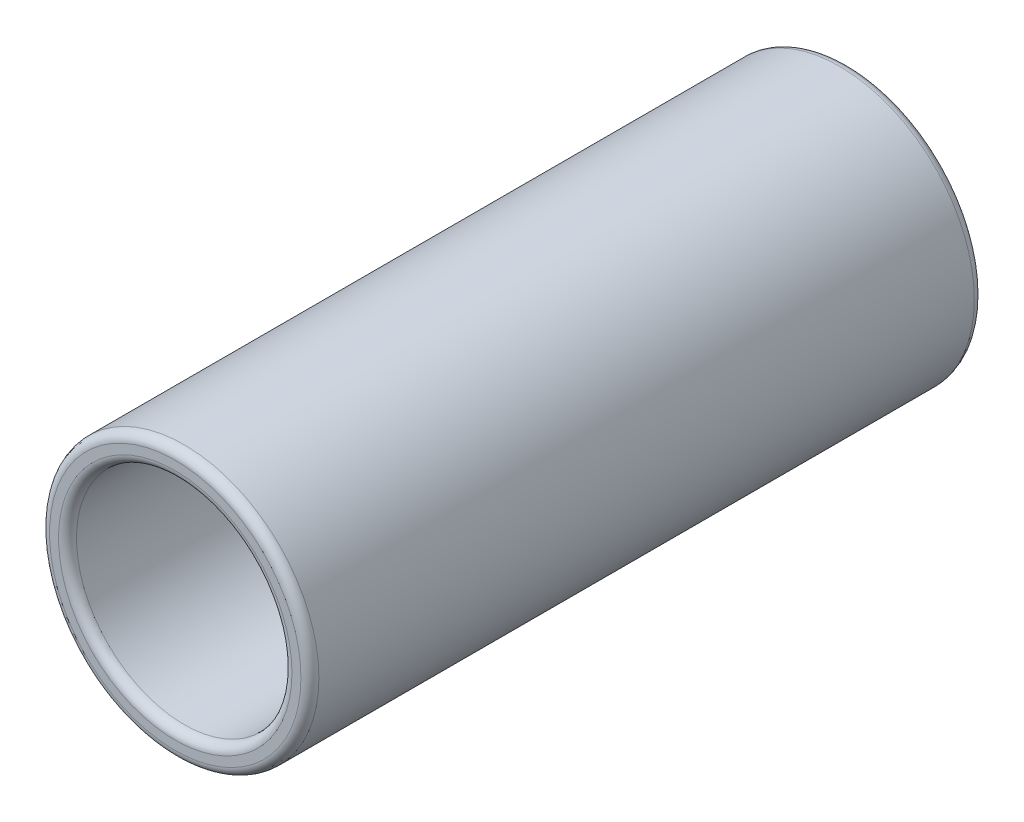
ISO-10303-21;
HEADER;
FILE_DESCRIPTION(('STEP AP214'),'2;1');
FILE_NAME('part.step','',(''),(''),'','','');
FILE_SCHEMA(('AUTOMOTIVE_DESIGN { 1 0 10303 214 1 1 1 1 }'));
ENDSEC;
DATA;
#1=APPLICATION_CONTEXT('core data for automotive mechanical design processes');
#2=APPLICATION_PROTOCOL_DEFINITION('international standard','automotive_design',2000,#1);
#3=PRODUCT_CONTEXT('',#1,'mechanical');
#4=PRODUCT('Part','Part','',(#3));
#5=PRODUCT_RELATED_PRODUCT_CATEGORY('part','',(#4));
#6=PRODUCT_DEFINITION_FORMATION('','',#4);
#7=PRODUCT_DEFINITION_CONTEXT('part definition',#1,'design');
#8=PRODUCT_DEFINITION('design','',#6,#7);
#9=PRODUCT_DEFINITION_SHAPE('','',#8);
#10=(LENGTH_UNIT() NAMED_UNIT(*) SI_UNIT(.MILLI.,.METRE.));
#11=(NAMED_UNIT(*) PLANE_ANGLE_UNIT() SI_UNIT($,.RADIAN.));
#12=(NAMED_UNIT(*) SI_UNIT($,.STERADIAN.) SOLID_ANGLE_UNIT());
#13=UNCERTAINTY_MEASURE_WITH_UNIT(LENGTH_MEASURE(1.E-05),#10,'distance_accuracy_value','');
#14=(GEOMETRIC_REPRESENTATION_CONTEXT(3) GLOBAL_UNCERTAINTY_ASSIGNED_CONTEXT((#13)) GLOBAL_UNIT_ASSIGNED_CONTEXT((#10,
#11,#12)) REPRESENTATION_CONTEXT('',''));
#15=CARTESIAN_POINT('',(0.,0.,0.));
#16=DIRECTION('',(0.,0.,1.));
#17=DIRECTION('',(1.,0.,0.));
#18=AXIS2_PLACEMENT_3D('',#15,#16,#17);
#19=CARTESIAN_POINT('',(0.,0.,7.5));
#20=DIRECTION('',(0.,0.,1.));
#21=DIRECTION('',(1.,0.,0.));
#22=AXIS2_PLACEMENT_3D('',#19,#20,#21);
#23=PLANE('',#22);
#24=CARTESIAN_POINT('',(0.,0.,7.5));
#25=DIRECTION('',(0.,0.,1.));
#26=DIRECTION('',(1.,0.,0.));
#27=AXIS2_PLACEMENT_3D('',#24,#25,#26);
#28=CIRCLE('',#27,1.4);
#29=CARTESIAN_POINT('',(1.4,0.,7.5));
#30=VERTEX_POINT('',#29);
#31=EDGE_CURVE('E10',#30,#30,#28,.T.);
#32=ORIENTED_EDGE('',*,*,#31,.T.);
#33=EDGE_LOOP('',(#32));
#34=FACE_BOUND('',#33,.T.);
#35=CARTESIAN_POINT('',(0.,0.,7.5));
#36=DIRECTION('',(0.,0.,1.));
#37=DIRECTION('',(1.,0.,0.));
#38=AXIS2_PLACEMENT_3D('',#35,#36,#37);
#39=CIRCLE('',#38,1.3);
#40=CARTESIAN_POINT('',(1.3,0.,7.5));
#41=VERTEX_POINT('',#40);
#42=EDGE_CURVE('E37',#41,#41,#39,.F.);
#43=ORIENTED_EDGE('',*,*,#42,.T.);
#44=EDGE_LOOP('',(#43));
#45=FACE_BOUND('',#44,.T.);
#46=ADVANCED_FACE('F30',(#34,#45),#23,.T.);
#47=CARTESIAN_POINT('',(0.,0.,0.));
#48=DIRECTION('',(0.,0.,1.));
#49=DIRECTION('',(1.,0.,0.));
#50=AXIS2_PLACEMENT_3D('',#47,#48,#49);
#51=PLANE('',#50);
#52=CARTESIAN_POINT('',(0.,0.,0.));
#53=DIRECTION('',(0.,0.,1.));
#54=DIRECTION('',(1.,0.,0.));
#55=AXIS2_PLACEMENT_3D('',#52,#53,#54);
#56=CIRCLE('',#55,1.3);
#57=CARTESIAN_POINT('',(1.3,0.,0.));
#58=VERTEX_POINT('',#57);
#59=EDGE_CURVE('E56',#58,#58,#56,.T.);
#60=ORIENTED_EDGE('',*,*,#59,.T.);
#61=EDGE_LOOP('',(#60));
#62=FACE_BOUND('',#61,.T.);
#63=CARTESIAN_POINT('',(0.,0.,0.));
#64=DIRECTION('',(0.,0.,1.));
#65=DIRECTION('',(1.,0.,0.));
#66=AXIS2_PLACEMENT_3D('',#63,#64,#65);
#67=CIRCLE('',#66,1.4);
#68=CARTESIAN_POINT('',(1.4,0.,0.));
#69=VERTEX_POINT('',#68);
#70=EDGE_CURVE('E59',#69,#69,#67,.F.);
#71=ORIENTED_EDGE('',*,*,#70,.T.);
#72=EDGE_LOOP('',(#71));
#73=FACE_BOUND('',#72,.T.);
#74=ADVANCED_FACE('F63',(#62,#73),#51,.F.);
#75=CARTESIAN_POINT('',(0.,0.,7.5));
#76=DIRECTION('',(0.,0.,-1.));
#77=DIRECTION('',(-1.,0.,0.));
#78=AXIS2_PLACEMENT_3D('',#75,#76,#77);
#79=CYLINDRICAL_SURFACE('',#78,1.5);
#80=CARTESIAN_POINT('',(0.,0.,0.1));
#81=DIRECTION('',(0.,0.,1.));
#82=DIRECTION('',(1.,0.,0.));
#83=AXIS2_PLACEMENT_3D('',#80,#81,#82);
#84=CIRCLE('',#83,1.5);
#85=CARTESIAN_POINT('',(1.5,0.,0.1));
#86=VERTEX_POINT('',#85);
#87=EDGE_CURVE('E41',#86,#86,#84,.T.);
#88=ORIENTED_EDGE('',*,*,#87,.T.);
#89=EDGE_LOOP('',(#88));
#90=FACE_BOUND('',#89,.T.);
#91=CARTESIAN_POINT('',(0.,0.,7.4));
#92=DIRECTION('',(0.,0.,1.));
#93=DIRECTION('',(1.,0.,0.));
#94=AXIS2_PLACEMENT_3D('',#91,#92,#93);
#95=CIRCLE('',#94,1.5);
#96=CARTESIAN_POINT('',(1.5,0.,7.4));
#97=VERTEX_POINT('',#96);
#98=EDGE_CURVE('E45',#97,#97,#95,.F.);
#99=ORIENTED_EDGE('',*,*,#98,.T.);
#100=EDGE_LOOP('',(#99));
#101=FACE_BOUND('',#100,.T.);
#102=ADVANCED_FACE('F73',(#90,#101),#79,.T.);
#103=CARTESIAN_POINT('',(0.,0.,7.5));
#104=DIRECTION('',(0.,0.,-1.));
#105=DIRECTION('',(-1.,0.,0.));
#106=AXIS2_PLACEMENT_3D('',#103,#104,#105);
#107=CYLINDRICAL_SURFACE('',#106,1.2);
#108=CARTESIAN_POINT('',(0.,0.,0.1));
#109=DIRECTION('',(0.,0.,1.));
#110=DIRECTION('',(1.,0.,0.));
#111=AXIS2_PLACEMENT_3D('',#108,#109,#110);
#112=CIRCLE('',#111,1.2);
#113=CARTESIAN_POINT('',(1.2,0.,0.1));
#114=VERTEX_POINT('',#113);
#115=EDGE_CURVE('E50',#114,#114,#112,.F.);
#116=ORIENTED_EDGE('',*,*,#115,.T.);
#117=EDGE_LOOP('',(#116));
#118=FACE_BOUND('',#117,.T.);
#119=CARTESIAN_POINT('',(0.,0.,7.4));
#120=DIRECTION('',(0.,0.,1.));
#121=DIRECTION('',(1.,0.,0.));
#122=AXIS2_PLACEMENT_3D('',#119,#120,#121);
#123=CIRCLE('',#122,1.2);
#124=CARTESIAN_POINT('',(1.2,0.,7.4));
#125=VERTEX_POINT('',#124);
#126=EDGE_CURVE('E53',#125,#125,#123,.T.);
#127=ORIENTED_EDGE('',*,*,#126,.T.);
#128=EDGE_LOOP('',(#127));
#129=FACE_BOUND('',#128,.T.);
#130=ADVANCED_FACE('F76',(#118,#129),#107,.F.);
#131=CARTESIAN_POINT('',(0.,0.,0.1));
#132=DIRECTION('',(0.,0.,1.));
#133=DIRECTION('',(1.,0.,0.));
#134=AXIS2_PLACEMENT_3D('',#131,#132,#133);
#135=TOROIDAL_SURFACE('',#134,1.3,0.1);
#136=ORIENTED_EDGE('',*,*,#115,.F.);
#137=EDGE_LOOP('',(#136));
#138=FACE_BOUND('',#137,.T.);
#139=ORIENTED_EDGE('',*,*,#59,.F.);
#140=EDGE_LOOP('',(#139));
#141=FACE_BOUND('',#140,.T.);
#142=ADVANCED_FACE('F69',(#138,#141),#135,.T.);
#143=CARTESIAN_POINT('',(0.,0.,0.1));
#144=DIRECTION('',(0.,0.,1.));
#145=DIRECTION('',(1.,0.,0.));
#146=AXIS2_PLACEMENT_3D('',#143,#144,#145);
#147=TOROIDAL_SURFACE('',#146,1.4,0.1);
#148=ORIENTED_EDGE('',*,*,#70,.F.);
#149=EDGE_LOOP('',(#148));
#150=FACE_BOUND('',#149,.T.);
#151=ORIENTED_EDGE('',*,*,#87,.F.);
#152=EDGE_LOOP('',(#151));
#153=FACE_BOUND('',#152,.T.);
#154=ADVANCED_FACE('F65',(#150,#153),#147,.T.);
#155=CARTESIAN_POINT('',(0.,0.,7.4));
#156=DIRECTION('',(0.,0.,1.));
#157=DIRECTION('',(1.,0.,0.));
#158=AXIS2_PLACEMENT_3D('',#155,#156,#157);
#159=TOROIDAL_SURFACE('',#158,1.4,0.1);
#160=ORIENTED_EDGE('',*,*,#98,.F.);
#161=EDGE_LOOP('',(#160));
#162=FACE_BOUND('',#161,.T.);
#163=ORIENTED_EDGE('',*,*,#31,.F.);
#164=EDGE_LOOP('',(#163));
#165=FACE_BOUND('',#164,.T.);
#166=ADVANCED_FACE('F68',(#162,#165),#159,.T.);
#167=CARTESIAN_POINT('',(0.,0.,7.4));
#168=DIRECTION('',(0.,0.,1.));
#169=DIRECTION('',(1.,0.,0.));
#170=AXIS2_PLACEMENT_3D('',#167,#168,#169);
#171=TOROIDAL_SURFACE('',#170,1.3,0.1);
#172=ORIENTED_EDGE('',*,*,#42,.F.);
#173=EDGE_LOOP('',(#172));
#174=FACE_BOUND('',#173,.T.);
#175=ORIENTED_EDGE('',*,*,#126,.F.);
#176=EDGE_LOOP('',(#175));
#177=FACE_BOUND('',#176,.T.);
#178=ADVANCED_FACE('F32',(#174,#177),#171,.T.);
#179=CLOSED_SHELL('',(#46,#74,#102,#130,#142,#154,#166,#178));
#180=MANIFOLD_SOLID_BREP('B2',#179);
#181=ADVANCED_BREP_SHAPE_REPRESENTATION('',(#18,#180),#14);
#182=SHAPE_DEFINITION_REPRESENTATION(#9,#181);
ENDSEC;
END-ISO-10303-21;
